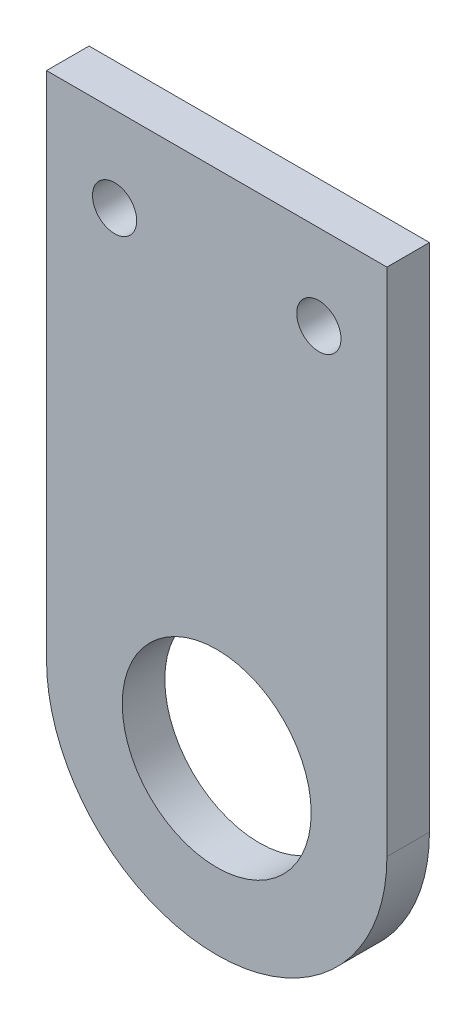
ISO-10303-21;
HEADER;
FILE_DESCRIPTION(('STEP AP214'),'2;1');
FILE_NAME('part.step','',(''),(''),'','','');
FILE_SCHEMA(('AUTOMOTIVE_DESIGN { 1 0 10303 214 1 1 1 1 }'));
ENDSEC;
DATA;
#1=APPLICATION_CONTEXT('core data for automotive mechanical design processes');
#2=APPLICATION_PROTOCOL_DEFINITION('international standard','automotive_design',2000,#1);
#3=PRODUCT_CONTEXT('',#1,'mechanical');
#4=PRODUCT('Part','Part','',(#3));
#5=PRODUCT_RELATED_PRODUCT_CATEGORY('part','',(#4));
#6=PRODUCT_DEFINITION_FORMATION('','',#4);
#7=PRODUCT_DEFINITION_CONTEXT('part definition',#1,'design');
#8=PRODUCT_DEFINITION('design','',#6,#7);
#9=PRODUCT_DEFINITION_SHAPE('','',#8);
#10=(LENGTH_UNIT() NAMED_UNIT(*) SI_UNIT(.MILLI.,.METRE.));
#11=(NAMED_UNIT(*) PLANE_ANGLE_UNIT() SI_UNIT($,.RADIAN.));
#12=(NAMED_UNIT(*) SI_UNIT($,.STERADIAN.) SOLID_ANGLE_UNIT());
#13=UNCERTAINTY_MEASURE_WITH_UNIT(LENGTH_MEASURE(1.E-05),#10,'distance_accuracy_value','');
#14=(GEOMETRIC_REPRESENTATION_CONTEXT(3) GLOBAL_UNCERTAINTY_ASSIGNED_CONTEXT((#13)) GLOBAL_UNIT_ASSIGNED_CONTEXT((#10,
#11,#12)) REPRESENTATION_CONTEXT('',''));
#15=CARTESIAN_POINT('',(0.,0.,0.));
#16=DIRECTION('',(0.,0.,1.));
#17=DIRECTION('',(1.,0.,0.));
#18=AXIS2_PLACEMENT_3D('',#15,#16,#17);
#19=CARTESIAN_POINT('',(-49.9999999999992,-78.2842712474618,60.));
#20=DIRECTION('',(1.,0.,0.));
#21=DIRECTION('',(0.,1.,0.));
#22=AXIS2_PLACEMENT_3D('',#19,#20,#21);
#23=PLANE('',#22);
#24=DIRECTION('',(0.,0.,1.));
#25=VECTOR('',#24,1.);
#26=CARTESIAN_POINT('',(-49.9999999999992,-290.,-5.));
#27=LINE('',#26,#25);
#28=CARTESIAN_POINT('',(-49.9999999999992,-290.,-5.));
#29=VERTEX_POINT('',#28);
#30=CARTESIAN_POINT('',(-49.9999999999992,-290.,0.));
#31=VERTEX_POINT('',#30);
#32=EDGE_CURVE('E60',#29,#31,#27,.T.);
#33=ORIENTED_EDGE('',*,*,#32,.T.);
#34=DIRECTION('',(0.,1.,0.));
#35=VECTOR('',#34,1.);
#36=CARTESIAN_POINT('',(-49.9999999999992,-290.,0.));
#37=LINE('',#36,#35);
#38=CARTESIAN_POINT('',(-49.9999999999992,-350.,0.));
#39=VERTEX_POINT('',#38);
#40=EDGE_CURVE('E103',#39,#31,#37,.T.);
#41=ORIENTED_EDGE('',*,*,#40,.F.);
#42=DIRECTION('',(0.,0.,1.));
#43=VECTOR('',#42,1.);
#44=CARTESIAN_POINT('',(-49.9999999999992,-350.,-5.));
#45=LINE('',#44,#43);
#46=CARTESIAN_POINT('',(-49.9999999999992,-350.,-5.));
#47=VERTEX_POINT('',#46);
#48=EDGE_CURVE('E126',#47,#39,#45,.T.);
#49=ORIENTED_EDGE('',*,*,#48,.F.);
#50=DIRECTION('',(0.,1.,0.));
#51=VECTOR('',#50,1.);
#52=CARTESIAN_POINT('',(-49.9999999999992,-290.,-5.));
#53=LINE('',#52,#51);
#54=EDGE_CURVE('E114',#47,#29,#53,.T.);
#55=ORIENTED_EDGE('',*,*,#54,.T.);
#56=EDGE_LOOP('',(#33,#41,#49,#55));
#57=FACE_BOUND('',#56,.T.);
#58=ADVANCED_FACE('F50',(#57),#23,.T.);
#59=CARTESIAN_POINT('',(-89.9999999999992,-61.7157287525382,60.));
#60=DIRECTION('',(1.,0.,0.));
#61=DIRECTION('',(0.,1.,0.));
#62=AXIS2_PLACEMENT_3D('',#59,#60,#61);
#63=PLANE('',#62);
#64=DIRECTION('',(0.,-1.,0.));
#65=VECTOR('',#64,1.);
#66=CARTESIAN_POINT('',(-89.9999999999992,-290.,0.));
#67=LINE('',#66,#65);
#68=CARTESIAN_POINT('',(-89.9999999999992,-290.,0.));
#69=VERTEX_POINT('',#68);
#70=CARTESIAN_POINT('',(-89.9999999999992,-350.,0.));
#71=VERTEX_POINT('',#70);
#72=EDGE_CURVE('E88',#69,#71,#67,.T.);
#73=ORIENTED_EDGE('',*,*,#72,.F.);
#74=DIRECTION('',(0.,0.,1.));
#75=VECTOR('',#74,1.);
#76=CARTESIAN_POINT('',(-89.9999999999992,-290.,-5.));
#77=LINE('',#76,#75);
#78=CARTESIAN_POINT('',(-89.9999999999992,-290.,-5.));
#79=VERTEX_POINT('',#78);
#80=EDGE_CURVE('E13',#79,#69,#77,.T.);
#81=ORIENTED_EDGE('',*,*,#80,.F.);
#82=DIRECTION('',(0.,-1.,0.));
#83=VECTOR('',#82,1.);
#84=CARTESIAN_POINT('',(-89.9999999999992,-290.,-5.));
#85=LINE('',#84,#83);
#86=CARTESIAN_POINT('',(-89.9999999999992,-350.,-5.));
#87=VERTEX_POINT('',#86);
#88=EDGE_CURVE('E115',#79,#87,#85,.T.);
#89=ORIENTED_EDGE('',*,*,#88,.T.);
#90=DIRECTION('',(0.,0.,1.));
#91=VECTOR('',#90,1.);
#92=CARTESIAN_POINT('',(-89.9999999999992,-350.,-5.));
#93=LINE('',#92,#91);
#94=EDGE_CURVE('E69',#87,#71,#93,.T.);
#95=ORIENTED_EDGE('',*,*,#94,.T.);
#96=EDGE_LOOP('',(#73,#81,#89,#95));
#97=FACE_BOUND('',#96,.T.);
#98=ADVANCED_FACE('F95',(#97),#63,.F.);
#99=CARTESIAN_POINT('',(-81.9999999999992,-300.,-5.));
#100=DIRECTION('',(0.,0.,1.));
#101=DIRECTION('',(1.,0.,0.));
#102=AXIS2_PLACEMENT_3D('',#99,#100,#101);
#103=CYLINDRICAL_SURFACE('',#102,2.6);
#104=CARTESIAN_POINT('',(-81.9999999999992,-300.,-5.));
#105=DIRECTION('',(0.,0.,1.));
#106=DIRECTION('',(1.,0.,0.));
#107=AXIS2_PLACEMENT_3D('',#104,#105,#106);
#108=CIRCLE('',#107,2.6);
#109=CARTESIAN_POINT('',(-79.3999999999992,-300.,-5.));
#110=VERTEX_POINT('',#109);
#111=EDGE_CURVE('E136',#110,#110,#108,.T.);
#112=ORIENTED_EDGE('',*,*,#111,.F.);
#113=EDGE_LOOP('',(#112));
#114=FACE_BOUND('',#113,.T.);
#115=CARTESIAN_POINT('',(-81.9999999999992,-300.,0.));
#116=DIRECTION('',(0.,0.,1.));
#117=DIRECTION('',(1.,0.,0.));
#118=AXIS2_PLACEMENT_3D('',#115,#116,#117);
#119=CIRCLE('',#118,2.6);
#120=CARTESIAN_POINT('',(-79.3999999999992,-300.,0.));
#121=VERTEX_POINT('',#120);
#122=EDGE_CURVE('E141',#121,#121,#119,.F.);
#123=ORIENTED_EDGE('',*,*,#122,.F.);
#124=EDGE_LOOP('',(#123));
#125=FACE_BOUND('',#124,.T.);
#126=ADVANCED_FACE('F152',(#114,#125),#103,.F.);
#127=CARTESIAN_POINT('',(-57.9999999999992,-300.,-5.));
#128=DIRECTION('',(0.,0.,1.));
#129=DIRECTION('',(1.,0.,0.));
#130=AXIS2_PLACEMENT_3D('',#127,#128,#129);
#131=CYLINDRICAL_SURFACE('',#130,2.59999999999999);
#132=CARTESIAN_POINT('',(-57.9999999999992,-300.,-5.));
#133=DIRECTION('',(0.,0.,1.));
#134=DIRECTION('',(1.,0.,0.));
#135=AXIS2_PLACEMENT_3D('',#132,#133,#134);
#136=CIRCLE('',#135,2.59999999999999);
#137=CARTESIAN_POINT('',(-55.3999999999992,-300.,-5.));
#138=VERTEX_POINT('',#137);
#139=EDGE_CURVE('E132',#138,#138,#136,.T.);
#140=ORIENTED_EDGE('',*,*,#139,.F.);
#141=EDGE_LOOP('',(#140));
#142=FACE_BOUND('',#141,.T.);
#143=CARTESIAN_POINT('',(-57.9999999999992,-300.,0.));
#144=DIRECTION('',(0.,0.,1.));
#145=DIRECTION('',(1.,0.,0.));
#146=AXIS2_PLACEMENT_3D('',#143,#144,#145);
#147=CIRCLE('',#146,2.59999999999999);
#148=CARTESIAN_POINT('',(-55.3999999999992,-300.,0.));
#149=VERTEX_POINT('',#148);
#150=EDGE_CURVE('E145',#149,#149,#147,.F.);
#151=ORIENTED_EDGE('',*,*,#150,.F.);
#152=EDGE_LOOP('',(#151));
#153=FACE_BOUND('',#152,.T.);
#154=ADVANCED_FACE('F150',(#142,#153),#131,.F.);
#155=CARTESIAN_POINT('',(-89.9999999999992,-290.,-5.));
#156=DIRECTION('',(0.,1.,0.));
#157=DIRECTION('',(0.,0.,1.));
#158=AXIS2_PLACEMENT_3D('',#155,#156,#157);
#159=PLANE('',#158);
#160=DIRECTION('',(-1.,0.,0.));
#161=VECTOR('',#160,1.);
#162=CARTESIAN_POINT('',(-89.9999999999992,-290.,0.));
#163=LINE('',#162,#161);
#164=EDGE_CURVE('E96',#31,#69,#163,.T.);
#165=ORIENTED_EDGE('',*,*,#164,.F.);
#166=ORIENTED_EDGE('',*,*,#32,.F.);
#167=DIRECTION('',(-1.,0.,0.));
#168=VECTOR('',#167,1.);
#169=CARTESIAN_POINT('',(-89.9999999999992,-290.,-5.));
#170=LINE('',#169,#168);
#171=EDGE_CURVE('E110',#29,#79,#170,.T.);
#172=ORIENTED_EDGE('',*,*,#171,.T.);
#173=ORIENTED_EDGE('',*,*,#80,.T.);
#174=EDGE_LOOP('',(#165,#166,#172,#173));
#175=FACE_BOUND('',#174,.T.);
#176=ADVANCED_FACE('F108',(#175),#159,.T.);
#177=CARTESIAN_POINT('',(-69.9999999999992,-350.,-5.));
#178=DIRECTION('',(0.,0.,1.));
#179=DIRECTION('',(1.,0.,0.));
#180=AXIS2_PLACEMENT_3D('',#177,#178,#179);
#181=CYLINDRICAL_SURFACE('',#180,20.);
#182=CARTESIAN_POINT('',(-69.9999999999992,-350.,0.));
#183=DIRECTION('',(0.,0.,1.));
#184=DIRECTION('',(1.,0.,0.));
#185=AXIS2_PLACEMENT_3D('',#182,#183,#184);
#186=CIRCLE('',#185,20.);
#187=EDGE_CURVE('E83',#71,#39,#186,.T.);
#188=ORIENTED_EDGE('',*,*,#187,.F.);
#189=ORIENTED_EDGE('',*,*,#94,.F.);
#190=CARTESIAN_POINT('',(-69.9999999999992,-350.,-5.));
#191=DIRECTION('',(0.,0.,1.));
#192=DIRECTION('',(1.,0.,0.));
#193=AXIS2_PLACEMENT_3D('',#190,#191,#192);
#194=CIRCLE('',#193,20.);
#195=EDGE_CURVE('E117',#87,#47,#194,.T.);
#196=ORIENTED_EDGE('',*,*,#195,.T.);
#197=ORIENTED_EDGE('',*,*,#48,.T.);
#198=EDGE_LOOP('',(#188,#189,#196,#197));
#199=FACE_BOUND('',#198,.T.);
#200=ADVANCED_FACE('F159',(#199),#181,.T.);
#201=CARTESIAN_POINT('',(-69.9999999999992,-350.,-5.));
#202=DIRECTION('',(0.,0.,-1.));
#203=DIRECTION('',(1.,0.,0.));
#204=AXIS2_PLACEMENT_3D('',#201,#202,#203);
#205=PLANE('',#204);
#206=ORIENTED_EDGE('',*,*,#139,.T.);
#207=EDGE_LOOP('',(#206));
#208=FACE_BOUND('',#207,.T.);
#209=ORIENTED_EDGE('',*,*,#111,.T.);
#210=EDGE_LOOP('',(#209));
#211=FACE_BOUND('',#210,.T.);
#212=CARTESIAN_POINT('',(-69.9999999999992,-350.,-5.));
#213=DIRECTION('',(0.,0.,-1.));
#214=DIRECTION('',(-1.,0.,0.));
#215=AXIS2_PLACEMENT_3D('',#212,#213,#214);
#216=CIRCLE('',#215,11.1);
#217=CARTESIAN_POINT('',(-81.0999999999992,-350.,-5.));
#218=VERTEX_POINT('',#217);
#219=EDGE_CURVE('E97',#218,#218,#216,.F.);
#220=ORIENTED_EDGE('',*,*,#219,.T.);
#221=EDGE_LOOP('',(#220));
#222=FACE_BOUND('',#221,.T.);
#223=ORIENTED_EDGE('',*,*,#88,.F.);
#224=ORIENTED_EDGE('',*,*,#171,.F.);
#225=ORIENTED_EDGE('',*,*,#54,.F.);
#226=ORIENTED_EDGE('',*,*,#195,.F.);
#227=EDGE_LOOP('',(#223,#224,#225,#226));
#228=FACE_BOUND('',#227,.T.);
#229=ADVANCED_FACE('F172',(#208,#211,#222,#228),#205,.T.);
#230=CARTESIAN_POINT('',(-69.9999999999992,-350.,0.));
#231=DIRECTION('',(0.,0.,-1.));
#232=DIRECTION('',(1.,0.,0.));
#233=AXIS2_PLACEMENT_3D('',#230,#231,#232);
#234=PLANE('',#233);
#235=ORIENTED_EDGE('',*,*,#40,.T.);
#236=ORIENTED_EDGE('',*,*,#164,.T.);
#237=ORIENTED_EDGE('',*,*,#72,.T.);
#238=ORIENTED_EDGE('',*,*,#187,.T.);
#239=EDGE_LOOP('',(#235,#236,#237,#238));
#240=FACE_BOUND('',#239,.T.);
#241=CARTESIAN_POINT('',(-69.9999999999992,-350.,0.));
#242=DIRECTION('',(0.,0.,-1.));
#243=DIRECTION('',(-1.,0.,0.));
#244=AXIS2_PLACEMENT_3D('',#241,#242,#243);
#245=CIRCLE('',#244,11.1);
#246=CARTESIAN_POINT('',(-81.0999999999992,-350.,0.));
#247=VERTEX_POINT('',#246);
#248=EDGE_CURVE('E54',#247,#247,#245,.F.);
#249=ORIENTED_EDGE('',*,*,#248,.F.);
#250=EDGE_LOOP('',(#249));
#251=FACE_BOUND('',#250,.T.);
#252=ORIENTED_EDGE('',*,*,#122,.T.);
#253=EDGE_LOOP('',(#252));
#254=FACE_BOUND('',#253,.T.);
#255=ORIENTED_EDGE('',*,*,#150,.T.);
#256=EDGE_LOOP('',(#255));
#257=FACE_BOUND('',#256,.T.);
#258=ADVANCED_FACE('F100',(#240,#251,#254,#257),#234,.F.);
#259=CARTESIAN_POINT('',(-69.9999999999992,-350.,-5.));
#260=DIRECTION('',(0.,0.,1.));
#261=DIRECTION('',(1.,0.,0.));
#262=AXIS2_PLACEMENT_3D('',#259,#260,#261);
#263=CYLINDRICAL_SURFACE('',#262,11.1);
#264=ORIENTED_EDGE('',*,*,#219,.F.);
#265=EDGE_LOOP('',(#264));
#266=FACE_BOUND('',#265,.T.);
#267=ORIENTED_EDGE('',*,*,#248,.T.);
#268=EDGE_LOOP('',(#267));
#269=FACE_BOUND('',#268,.T.);
#270=ADVANCED_FACE('F52',(#266,#269),#263,.F.);
#271=CLOSED_SHELL('',(#58,#98,#126,#154,#176,#200,#229,#258,#270));
#272=MANIFOLD_SOLID_BREP('B2',#271);
#273=ADVANCED_BREP_SHAPE_REPRESENTATION('',(#18,#272),#14);
#274=SHAPE_DEFINITION_REPRESENTATION(#9,#273);
ENDSEC;
END-ISO-10303-21;
